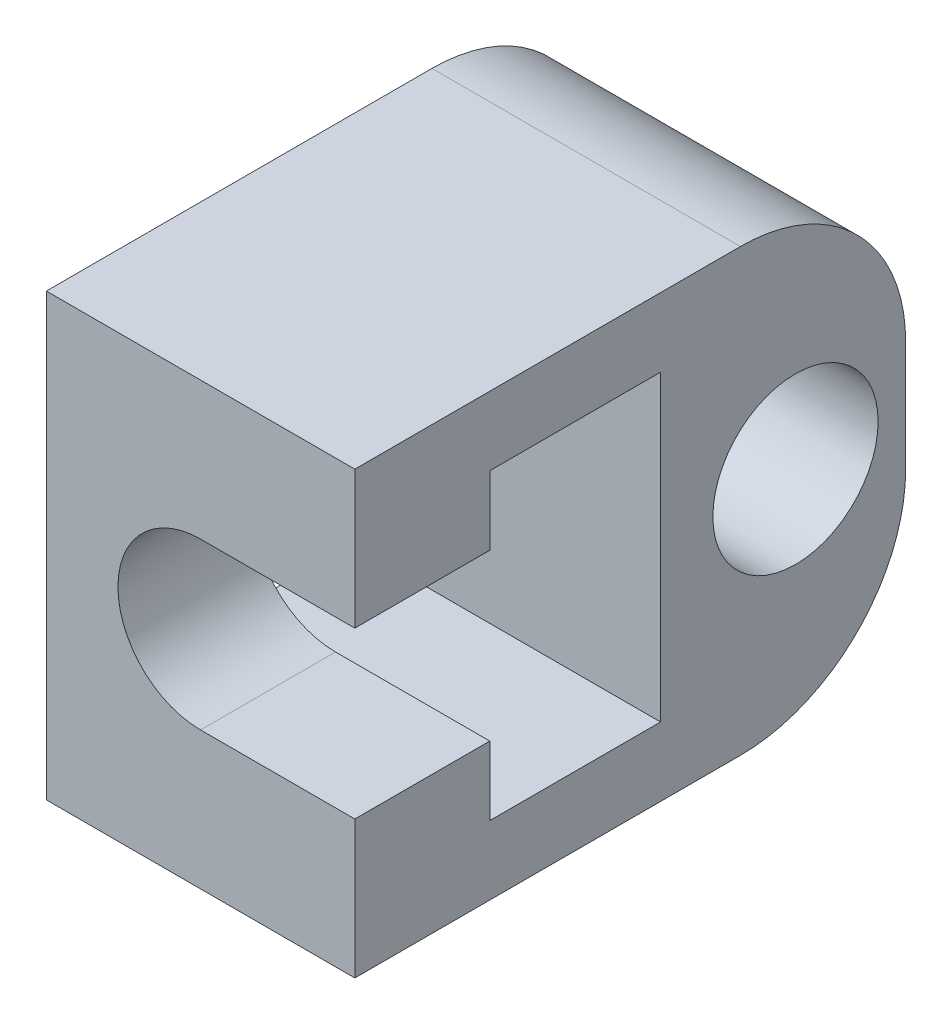
ISO-10303-21;
HEADER;
FILE_DESCRIPTION(('STEP AP214'),'2;1');
FILE_NAME('part.step','',(''),(''),'','','');
FILE_SCHEMA(('AUTOMOTIVE_DESIGN { 1 0 10303 214 1 1 1 1 }'));
ENDSEC;
DATA;
#1=APPLICATION_CONTEXT('core data for automotive mechanical design processes');
#2=APPLICATION_PROTOCOL_DEFINITION('international standard','automotive_design',2000,#1);
#3=PRODUCT_CONTEXT('',#1,'mechanical');
#4=PRODUCT('Part','Part','',(#3));
#5=PRODUCT_RELATED_PRODUCT_CATEGORY('part','',(#4));
#6=PRODUCT_DEFINITION_FORMATION('','',#4);
#7=PRODUCT_DEFINITION_CONTEXT('part definition',#1,'design');
#8=PRODUCT_DEFINITION('design','',#6,#7);
#9=PRODUCT_DEFINITION_SHAPE('','',#8);
#10=(LENGTH_UNIT() NAMED_UNIT(*) SI_UNIT(.MILLI.,.METRE.));
#11=(NAMED_UNIT(*) PLANE_ANGLE_UNIT() SI_UNIT($,.RADIAN.));
#12=(NAMED_UNIT(*) SI_UNIT($,.STERADIAN.) SOLID_ANGLE_UNIT());
#13=UNCERTAINTY_MEASURE_WITH_UNIT(LENGTH_MEASURE(1.E-05),#10,'distance_accuracy_value','');
#14=(GEOMETRIC_REPRESENTATION_CONTEXT(3) GLOBAL_UNCERTAINTY_ASSIGNED_CONTEXT((#13)) GLOBAL_UNIT_ASSIGNED_CONTEXT((#10,
#11,#12)) REPRESENTATION_CONTEXT('',''));
#15=CARTESIAN_POINT('',(0.,0.,0.));
#16=DIRECTION('',(0.,0.,1.));
#17=DIRECTION('',(1.,0.,0.));
#18=AXIS2_PLACEMENT_3D('',#15,#16,#17);
#19=CARTESIAN_POINT('',(2.8,8.,5.));
#20=DIRECTION('',(0.,0.,-1.));
#21=DIRECTION('',(-1.,0.,0.));
#22=AXIS2_PLACEMENT_3D('',#19,#20,#21);
#23=PLANE('',#22);
#24=DIRECTION('',(-1.,0.,0.));
#25=VECTOR('',#24,1.);
#26=CARTESIAN_POINT('',(0.,2.5,5.));
#27=LINE('',#26,#25);
#28=CARTESIAN_POINT('',(2.8,2.5,5.));
#29=VERTEX_POINT('',#28);
#30=CARTESIAN_POINT('',(0.,2.5,5.));
#31=VERTEX_POINT('',#30);
#32=EDGE_CURVE('E162',#29,#31,#27,.T.);
#33=ORIENTED_EDGE('',*,*,#32,.T.);
#34=CARTESIAN_POINT('',(0.,4.,5.));
#35=DIRECTION('',(0.,0.,1.));
#36=DIRECTION('',(1.,0.,0.));
#37=AXIS2_PLACEMENT_3D('',#34,#35,#36);
#38=CIRCLE('',#37,1.5);
#39=CARTESIAN_POINT('',(0.,5.5,5.));
#40=VERTEX_POINT('',#39);
#41=EDGE_CURVE('E293',#40,#31,#38,.T.);
#42=ORIENTED_EDGE('',*,*,#41,.F.);
#43=DIRECTION('',(1.,0.,0.));
#44=VECTOR('',#43,1.);
#45=CARTESIAN_POINT('',(0.,5.5,5.));
#46=LINE('',#45,#44);
#47=CARTESIAN_POINT('',(2.8,5.5,5.));
#48=VERTEX_POINT('',#47);
#49=EDGE_CURVE('E283',#40,#48,#46,.T.);
#50=ORIENTED_EDGE('',*,*,#49,.T.);
#51=DIRECTION('',(0.,-1.,0.));
#52=VECTOR('',#51,1.);
#53=CARTESIAN_POINT('',(2.8,8.,5.));
#54=LINE('',#53,#52);
#55=CARTESIAN_POINT('',(2.8,8.,5.));
#56=VERTEX_POINT('',#55);
#57=EDGE_CURVE('E163',#56,#48,#54,.T.);
#58=ORIENTED_EDGE('',*,*,#57,.F.);
#59=DIRECTION('',(1.,0.,0.));
#60=VECTOR('',#59,1.);
#61=CARTESIAN_POINT('',(2.8,8.,5.));
#62=LINE('',#61,#60);
#63=CARTESIAN_POINT('',(-2.8,8.,5.));
#64=VERTEX_POINT('',#63);
#65=EDGE_CURVE('E195',#64,#56,#62,.T.);
#66=ORIENTED_EDGE('',*,*,#65,.F.);
#67=DIRECTION('',(0.,-1.,0.));
#68=VECTOR('',#67,1.);
#69=CARTESIAN_POINT('',(-2.8,8.,5.));
#70=LINE('',#69,#68);
#71=CARTESIAN_POINT('',(-2.8,0.,5.));
#72=VERTEX_POINT('',#71);
#73=EDGE_CURVE('E208',#64,#72,#70,.T.);
#74=ORIENTED_EDGE('',*,*,#73,.T.);
#75=DIRECTION('',(1.,0.,0.));
#76=VECTOR('',#75,1.);
#77=CARTESIAN_POINT('',(2.8,0.,5.));
#78=LINE('',#77,#76);
#79=CARTESIAN_POINT('',(2.8,0.,5.));
#80=VERTEX_POINT('',#79);
#81=EDGE_CURVE('E198',#72,#80,#78,.T.);
#82=ORIENTED_EDGE('',*,*,#81,.T.);
#83=EDGE_CURVE('E206',#29,#80,#54,.T.);
#84=ORIENTED_EDGE('',*,*,#83,.F.);
#85=EDGE_LOOP('',(#33,#42,#50,#58,#66,#74,#82,#84));
#86=FACE_BOUND('',#85,.T.);
#87=ADVANCED_FACE('F39',(#86),#23,.F.);
#88=CARTESIAN_POINT('',(2.8,8.,5.));
#89=DIRECTION('',(-1.,0.,0.));
#90=DIRECTION('',(0.,0.,1.));
#91=AXIS2_PLACEMENT_3D('',#88,#89,#90);
#92=PLANE('',#91);
#93=CARTESIAN_POINT('',(2.8,4.,-3.));
#94=DIRECTION('',(1.,0.,0.));
#95=DIRECTION('',(0.,0.,-1.));
#96=AXIS2_PLACEMENT_3D('',#93,#94,#95);
#97=CIRCLE('',#96,1.5);
#98=CARTESIAN_POINT('',(2.8,4.,-4.5));
#99=VERTEX_POINT('',#98);
#100=EDGE_CURVE('E313',#99,#99,#97,.T.);
#101=ORIENTED_EDGE('',*,*,#100,.F.);
#102=EDGE_LOOP('',(#101));
#103=FACE_BOUND('',#102,.T.);
#104=DIRECTION('',(0.,0.,-1.));
#105=VECTOR('',#104,1.);
#106=CARTESIAN_POINT('',(2.8,0.,5.));
#107=LINE('',#106,#105);
#108=CARTESIAN_POINT('',(2.8,0.,-2.));
#109=VERTEX_POINT('',#108);
#110=EDGE_CURVE('E194',#80,#109,#107,.T.);
#111=ORIENTED_EDGE('',*,*,#110,.T.);
#112=CARTESIAN_POINT('',(2.8,3.,-2.));
#113=DIRECTION('',(-1.,0.,0.));
#114=DIRECTION('',(0.,0.,1.));
#115=AXIS2_PLACEMENT_3D('',#112,#113,#114);
#116=CIRCLE('',#115,3.);
#117=CARTESIAN_POINT('',(2.8,3.,-5.));
#118=VERTEX_POINT('',#117);
#119=EDGE_CURVE('E50',#109,#118,#116,.F.);
#120=ORIENTED_EDGE('',*,*,#119,.T.);
#121=DIRECTION('',(0.,-1.,0.));
#122=VECTOR('',#121,1.);
#123=CARTESIAN_POINT('',(2.8,8.,-5.));
#124=LINE('',#123,#122);
#125=CARTESIAN_POINT('',(2.8,5.,-5.));
#126=VERTEX_POINT('',#125);
#127=EDGE_CURVE('E201',#126,#118,#124,.T.);
#128=ORIENTED_EDGE('',*,*,#127,.F.);
#129=CARTESIAN_POINT('',(2.8,5.,-2.));
#130=DIRECTION('',(-1.,0.,0.));
#131=DIRECTION('',(0.,0.,1.));
#132=AXIS2_PLACEMENT_3D('',#129,#130,#131);
#133=CIRCLE('',#132,3.);
#134=CARTESIAN_POINT('',(2.8,8.,-2.));
#135=VERTEX_POINT('',#134);
#136=EDGE_CURVE('E53',#126,#135,#133,.F.);
#137=ORIENTED_EDGE('',*,*,#136,.T.);
#138=DIRECTION('',(0.,0.,-1.));
#139=VECTOR('',#138,1.);
#140=CARTESIAN_POINT('',(2.8,8.,5.));
#141=LINE('',#140,#139);
#142=EDGE_CURVE('E193',#56,#135,#141,.T.);
#143=ORIENTED_EDGE('',*,*,#142,.F.);
#144=ORIENTED_EDGE('',*,*,#57,.T.);
#145=DIRECTION('',(0.,0.,1.));
#146=VECTOR('',#145,1.);
#147=CARTESIAN_POINT('',(2.8,5.5,-5.001));
#148=LINE('',#147,#146);
#149=CARTESIAN_POINT('',(2.8,5.5,2.55));
#150=VERTEX_POINT('',#149);
#151=EDGE_CURVE('E149',#150,#48,#148,.T.);
#152=ORIENTED_EDGE('',*,*,#151,.F.);
#153=DIRECTION('',(0.,-1.,0.));
#154=VECTOR('',#153,1.);
#155=CARTESIAN_POINT('',(2.8,1.25,2.55));
#156=LINE('',#155,#154);
#157=CARTESIAN_POINT('',(2.8,6.75,2.55));
#158=VERTEX_POINT('',#157);
#159=EDGE_CURVE('E159',#158,#150,#156,.T.);
#160=ORIENTED_EDGE('',*,*,#159,.F.);
#161=DIRECTION('',(0.,0.,1.));
#162=VECTOR('',#161,1.);
#163=CARTESIAN_POINT('',(2.8,6.75,2.55));
#164=LINE('',#163,#162);
#165=CARTESIAN_POINT('',(2.8,6.75,-0.549999999999998));
#166=VERTEX_POINT('',#165);
#167=EDGE_CURVE('E174',#166,#158,#164,.T.);
#168=ORIENTED_EDGE('',*,*,#167,.F.);
#169=DIRECTION('',(0.,1.,0.));
#170=VECTOR('',#169,1.);
#171=CARTESIAN_POINT('',(2.8,1.25,-0.550000000000001));
#172=LINE('',#171,#170);
#173=CARTESIAN_POINT('',(2.8,1.25,-0.550000000000001));
#174=VERTEX_POINT('',#173);
#175=EDGE_CURVE('E285',#174,#166,#172,.T.);
#176=ORIENTED_EDGE('',*,*,#175,.F.);
#177=DIRECTION('',(0.,0.,-1.));
#178=VECTOR('',#177,1.);
#179=CARTESIAN_POINT('',(2.8,1.25,2.55));
#180=LINE('',#179,#178);
#181=CARTESIAN_POINT('',(2.8,1.25,2.55));
#182=VERTEX_POINT('',#181);
#183=EDGE_CURVE('E169',#182,#174,#180,.T.);
#184=ORIENTED_EDGE('',*,*,#183,.F.);
#185=CARTESIAN_POINT('',(2.8,2.5,2.55));
#186=VERTEX_POINT('',#185);
#187=EDGE_CURVE('E167',#186,#182,#156,.T.);
#188=ORIENTED_EDGE('',*,*,#187,.F.);
#189=DIRECTION('',(0.,0.,1.));
#190=VECTOR('',#189,1.);
#191=CARTESIAN_POINT('',(2.8,2.5,-5.001));
#192=LINE('',#191,#190);
#193=EDGE_CURVE('E294',#186,#29,#192,.T.);
#194=ORIENTED_EDGE('',*,*,#193,.T.);
#195=ORIENTED_EDGE('',*,*,#83,.T.);
#196=EDGE_LOOP('',(#111,#120,#128,#137,#143,#144,#152,#160,#168,#176,#184,#188,#194,#195));
#197=FACE_BOUND('',#196,.T.);
#198=ADVANCED_FACE('F160',(#103,#197),#92,.F.);
#199=CARTESIAN_POINT('',(-2.8,1.25,2.55));
#200=DIRECTION('',(0.,0.,1.));
#201=DIRECTION('',(0.,-1.,0.));
#202=AXIS2_PLACEMENT_3D('',#199,#200,#201);
#203=PLANE('',#202);
#204=DIRECTION('',(1.,0.,0.));
#205=VECTOR('',#204,1.);
#206=CARTESIAN_POINT('',(0.,2.5,2.55));
#207=LINE('',#206,#205);
#208=CARTESIAN_POINT('',(0.,2.5,2.55));
#209=VERTEX_POINT('',#208);
#210=EDGE_CURVE('E295',#209,#186,#207,.T.);
#211=ORIENTED_EDGE('',*,*,#210,.T.);
#212=ORIENTED_EDGE('',*,*,#187,.T.);
#213=DIRECTION('',(1.,0.,0.));
#214=VECTOR('',#213,1.);
#215=CARTESIAN_POINT('',(-2.8,1.25,2.55));
#216=LINE('',#215,#214);
#217=CARTESIAN_POINT('',(-2.8,1.25,2.55));
#218=VERTEX_POINT('',#217);
#219=EDGE_CURVE('E185',#218,#182,#216,.T.);
#220=ORIENTED_EDGE('',*,*,#219,.F.);
#221=DIRECTION('',(0.,-1.,0.));
#222=VECTOR('',#221,1.);
#223=CARTESIAN_POINT('',(-2.8,1.25,2.55));
#224=LINE('',#223,#222);
#225=CARTESIAN_POINT('',(-2.8,6.75,2.55));
#226=VERTEX_POINT('',#225);
#227=EDGE_CURVE('E280',#226,#218,#224,.T.);
#228=ORIENTED_EDGE('',*,*,#227,.F.);
#229=DIRECTION('',(1.,0.,0.));
#230=VECTOR('',#229,1.);
#231=CARTESIAN_POINT('',(-2.8,6.75,2.55));
#232=LINE('',#231,#230);
#233=EDGE_CURVE('E170',#226,#158,#232,.T.);
#234=ORIENTED_EDGE('',*,*,#233,.T.);
#235=ORIENTED_EDGE('',*,*,#159,.T.);
#236=DIRECTION('',(-1.,0.,0.));
#237=VECTOR('',#236,1.);
#238=CARTESIAN_POINT('',(0.,5.5,2.55));
#239=LINE('',#238,#237);
#240=CARTESIAN_POINT('',(0.,5.5,2.55));
#241=VERTEX_POINT('',#240);
#242=EDGE_CURVE('E144',#150,#241,#239,.T.);
#243=ORIENTED_EDGE('',*,*,#242,.T.);
#244=CARTESIAN_POINT('',(0.,4.,2.55));
#245=DIRECTION('',(0.,0.,1.));
#246=DIRECTION('',(0.,-1.,0.));
#247=AXIS2_PLACEMENT_3D('',#244,#245,#246);
#248=CIRCLE('',#247,1.5);
#249=EDGE_CURVE('E308',#209,#241,#248,.F.);
#250=ORIENTED_EDGE('',*,*,#249,.F.);
#251=EDGE_LOOP('',(#211,#212,#220,#228,#234,#235,#243,#250));
#252=FACE_BOUND('',#251,.T.);
#253=ADVANCED_FACE('F164',(#252),#203,.F.);
#254=CARTESIAN_POINT('',(-2.8,8.,5.));
#255=DIRECTION('',(1.,0.,0.));
#256=DIRECTION('',(0.,0.,-1.));
#257=AXIS2_PLACEMENT_3D('',#254,#255,#256);
#258=PLANE('',#257);
#259=CARTESIAN_POINT('',(-2.8,4.,-3.));
#260=DIRECTION('',(1.,0.,0.));
#261=DIRECTION('',(0.,0.,-1.));
#262=AXIS2_PLACEMENT_3D('',#259,#260,#261);
#263=CIRCLE('',#262,1.5);
#264=CARTESIAN_POINT('',(-2.8,4.,-4.5));
#265=VERTEX_POINT('',#264);
#266=EDGE_CURVE('E266',#265,#265,#263,.T.);
#267=ORIENTED_EDGE('',*,*,#266,.T.);
#268=EDGE_LOOP('',(#267));
#269=FACE_BOUND('',#268,.T.);
#270=DIRECTION('',(0.,0.,-1.));
#271=VECTOR('',#270,1.);
#272=CARTESIAN_POINT('',(-2.8,1.25,2.55));
#273=LINE('',#272,#271);
#274=CARTESIAN_POINT('',(-2.8,1.25,-0.550000000000001));
#275=VERTEX_POINT('',#274);
#276=EDGE_CURVE('E186',#218,#275,#273,.T.);
#277=ORIENTED_EDGE('',*,*,#276,.T.);
#278=DIRECTION('',(0.,1.,0.));
#279=VECTOR('',#278,1.);
#280=CARTESIAN_POINT('',(-2.8,1.25,-0.550000000000001));
#281=LINE('',#280,#279);
#282=CARTESIAN_POINT('',(-2.8,6.75,-0.549999999999998));
#283=VERTEX_POINT('',#282);
#284=EDGE_CURVE('E173',#275,#283,#281,.T.);
#285=ORIENTED_EDGE('',*,*,#284,.T.);
#286=DIRECTION('',(0.,0.,1.));
#287=VECTOR('',#286,1.);
#288=CARTESIAN_POINT('',(-2.8,6.75,2.55));
#289=LINE('',#288,#287);
#290=EDGE_CURVE('E278',#283,#226,#289,.T.);
#291=ORIENTED_EDGE('',*,*,#290,.T.);
#292=ORIENTED_EDGE('',*,*,#227,.T.);
#293=EDGE_LOOP('',(#277,#285,#291,#292));
#294=FACE_BOUND('',#293,.T.);
#295=DIRECTION('',(0.,-1.,0.));
#296=VECTOR('',#295,1.);
#297=CARTESIAN_POINT('',(-2.8,8.,-5.));
#298=LINE('',#297,#296);
#299=CARTESIAN_POINT('',(-2.8,5.,-5.));
#300=VERTEX_POINT('',#299);
#301=CARTESIAN_POINT('',(-2.8,3.,-5.));
#302=VERTEX_POINT('',#301);
#303=EDGE_CURVE('E200',#300,#302,#298,.T.);
#304=ORIENTED_EDGE('',*,*,#303,.T.);
#305=CARTESIAN_POINT('',(-2.8,3.,-2.));
#306=DIRECTION('',(1.,0.,0.));
#307=DIRECTION('',(0.,0.,-1.));
#308=AXIS2_PLACEMENT_3D('',#305,#306,#307);
#309=CIRCLE('',#308,3.);
#310=CARTESIAN_POINT('',(-2.8,0.,-2.));
#311=VERTEX_POINT('',#310);
#312=EDGE_CURVE('E217',#302,#311,#309,.F.);
#313=ORIENTED_EDGE('',*,*,#312,.T.);
#314=DIRECTION('',(0.,0.,1.));
#315=VECTOR('',#314,1.);
#316=CARTESIAN_POINT('',(-2.8,0.,5.));
#317=LINE('',#316,#315);
#318=EDGE_CURVE('E181',#311,#72,#317,.T.);
#319=ORIENTED_EDGE('',*,*,#318,.T.);
#320=ORIENTED_EDGE('',*,*,#73,.F.);
#321=DIRECTION('',(0.,0.,1.));
#322=VECTOR('',#321,1.);
#323=CARTESIAN_POINT('',(-2.8,8.,5.));
#324=LINE('',#323,#322);
#325=CARTESIAN_POINT('',(-2.8,8.,-2.));
#326=VERTEX_POINT('',#325);
#327=EDGE_CURVE('E188',#326,#64,#324,.T.);
#328=ORIENTED_EDGE('',*,*,#327,.F.);
#329=CARTESIAN_POINT('',(-2.8,5.,-2.));
#330=DIRECTION('',(1.,0.,0.));
#331=DIRECTION('',(0.,0.,-1.));
#332=AXIS2_PLACEMENT_3D('',#329,#330,#331);
#333=CIRCLE('',#332,3.);
#334=EDGE_CURVE('E220',#326,#300,#333,.F.);
#335=ORIENTED_EDGE('',*,*,#334,.T.);
#336=EDGE_LOOP('',(#304,#313,#319,#320,#328,#335));
#337=FACE_BOUND('',#336,.T.);
#338=ADVANCED_FACE('F235',(#269,#294,#337),#258,.F.);
#339=CARTESIAN_POINT('',(2.8,8.,-5.));
#340=DIRECTION('',(0.,0.,1.));
#341=DIRECTION('',(1.,0.,0.));
#342=AXIS2_PLACEMENT_3D('',#339,#340,#341);
#343=PLANE('',#342);
#344=ORIENTED_EDGE('',*,*,#127,.T.);
#345=DIRECTION('',(-1.,0.,0.));
#346=VECTOR('',#345,1.);
#347=CARTESIAN_POINT('',(2.8,3.,-5.));
#348=LINE('',#347,#346);
#349=EDGE_CURVE('E213',#118,#302,#348,.T.);
#350=ORIENTED_EDGE('',*,*,#349,.T.);
#351=ORIENTED_EDGE('',*,*,#303,.F.);
#352=DIRECTION('',(-1.,0.,0.));
#353=VECTOR('',#352,1.);
#354=CARTESIAN_POINT('',(2.8,5.,-5.));
#355=LINE('',#354,#353);
#356=EDGE_CURVE('E214',#300,#126,#355,.F.);
#357=ORIENTED_EDGE('',*,*,#356,.T.);
#358=EDGE_LOOP('',(#344,#350,#351,#357));
#359=FACE_BOUND('',#358,.T.);
#360=ADVANCED_FACE('F227',(#359),#343,.F.);
#361=CARTESIAN_POINT('',(0.,8.,0.));
#362=DIRECTION('',(0.,1.,0.));
#363=DIRECTION('',(0.,0.,1.));
#364=AXIS2_PLACEMENT_3D('',#361,#362,#363);
#365=PLANE('',#364);
#366=ORIENTED_EDGE('',*,*,#142,.T.);
#367=DIRECTION('',(-1.,0.,0.));
#368=VECTOR('',#367,1.);
#369=CARTESIAN_POINT('',(-2.8,8.,-2.));
#370=LINE('',#369,#368);
#371=EDGE_CURVE('E11',#135,#326,#370,.T.);
#372=ORIENTED_EDGE('',*,*,#371,.T.);
#373=ORIENTED_EDGE('',*,*,#327,.T.);
#374=ORIENTED_EDGE('',*,*,#65,.T.);
#375=EDGE_LOOP('',(#366,#372,#373,#374));
#376=FACE_BOUND('',#375,.T.);
#377=ADVANCED_FACE('F245',(#376),#365,.T.);
#378=CARTESIAN_POINT('',(0.,0.,0.));
#379=DIRECTION('',(0.,1.,0.));
#380=DIRECTION('',(0.,0.,1.));
#381=AXIS2_PLACEMENT_3D('',#378,#379,#380);
#382=PLANE('',#381);
#383=ORIENTED_EDGE('',*,*,#318,.F.);
#384=DIRECTION('',(-1.,0.,0.));
#385=VECTOR('',#384,1.);
#386=CARTESIAN_POINT('',(0.,0.,-2.));
#387=LINE('',#386,#385);
#388=EDGE_CURVE('E65',#311,#109,#387,.F.);
#389=ORIENTED_EDGE('',*,*,#388,.T.);
#390=ORIENTED_EDGE('',*,*,#110,.F.);
#391=ORIENTED_EDGE('',*,*,#81,.F.);
#392=EDGE_LOOP('',(#383,#389,#390,#391));
#393=FACE_BOUND('',#392,.T.);
#394=ADVANCED_FACE('F232',(#393),#382,.F.);
#395=CARTESIAN_POINT('',(-2.8,1.25,-0.550000000000001));
#396=DIRECTION('',(0.,0.,-1.));
#397=DIRECTION('',(0.,1.,0.));
#398=AXIS2_PLACEMENT_3D('',#395,#396,#397);
#399=PLANE('',#398);
#400=ORIENTED_EDGE('',*,*,#175,.T.);
#401=DIRECTION('',(1.,0.,0.));
#402=VECTOR('',#401,1.);
#403=CARTESIAN_POINT('',(-2.8,6.75,-0.549999999999998));
#404=LINE('',#403,#402);
#405=EDGE_CURVE('E187',#283,#166,#404,.T.);
#406=ORIENTED_EDGE('',*,*,#405,.F.);
#407=ORIENTED_EDGE('',*,*,#284,.F.);
#408=DIRECTION('',(1.,0.,0.));
#409=VECTOR('',#408,1.);
#410=CARTESIAN_POINT('',(-2.8,1.25,-0.550000000000001));
#411=LINE('',#410,#409);
#412=EDGE_CURVE('E177',#275,#174,#411,.T.);
#413=ORIENTED_EDGE('',*,*,#412,.T.);
#414=EDGE_LOOP('',(#400,#406,#407,#413));
#415=FACE_BOUND('',#414,.T.);
#416=ADVANCED_FACE('F334',(#415),#399,.F.);
#417=CARTESIAN_POINT('',(-2.8,1.25,2.55));
#418=DIRECTION('',(0.,-1.,0.));
#419=DIRECTION('',(0.,0.,-1.));
#420=AXIS2_PLACEMENT_3D('',#417,#418,#419);
#421=PLANE('',#420);
#422=ORIENTED_EDGE('',*,*,#183,.T.);
#423=ORIENTED_EDGE('',*,*,#412,.F.);
#424=ORIENTED_EDGE('',*,*,#276,.F.);
#425=ORIENTED_EDGE('',*,*,#219,.T.);
#426=EDGE_LOOP('',(#422,#423,#424,#425));
#427=FACE_BOUND('',#426,.T.);
#428=ADVANCED_FACE('F306',(#427),#421,.F.);
#429=CARTESIAN_POINT('',(-2.8,6.75,2.55));
#430=DIRECTION('',(0.,1.,0.));
#431=DIRECTION('',(0.,0.,1.));
#432=AXIS2_PLACEMENT_3D('',#429,#430,#431);
#433=PLANE('',#432);
#434=ORIENTED_EDGE('',*,*,#167,.T.);
#435=ORIENTED_EDGE('',*,*,#233,.F.);
#436=ORIENTED_EDGE('',*,*,#290,.F.);
#437=ORIENTED_EDGE('',*,*,#405,.T.);
#438=EDGE_LOOP('',(#434,#435,#436,#437));
#439=FACE_BOUND('',#438,.T.);
#440=ADVANCED_FACE('F303',(#439),#433,.F.);
#441=CARTESIAN_POINT('',(0.,4.,-5.001));
#442=DIRECTION('',(0.,0.,1.));
#443=DIRECTION('',(1.,0.,0.));
#444=AXIS2_PLACEMENT_3D('',#441,#442,#443);
#445=CYLINDRICAL_SURFACE('',#444,1.5);
#446=ORIENTED_EDGE('',*,*,#249,.T.);
#447=DIRECTION('',(0.,0.,1.));
#448=VECTOR('',#447,1.);
#449=CARTESIAN_POINT('',(0.,5.5,-5.001));
#450=LINE('',#449,#448);
#451=EDGE_CURVE('E148',#241,#40,#450,.T.);
#452=ORIENTED_EDGE('',*,*,#451,.T.);
#453=ORIENTED_EDGE('',*,*,#41,.T.);
#454=DIRECTION('',(0.,0.,1.));
#455=VECTOR('',#454,1.);
#456=CARTESIAN_POINT('',(0.,2.5,-5.001));
#457=LINE('',#456,#455);
#458=EDGE_CURVE('E298',#209,#31,#457,.T.);
#459=ORIENTED_EDGE('',*,*,#458,.F.);
#460=EDGE_LOOP('',(#446,#452,#453,#459));
#461=FACE_BOUND('',#460,.T.);
#462=ADVANCED_FACE('F328',(#461),#445,.F.);
#463=CARTESIAN_POINT('',(0.,2.5,-5.001));
#464=DIRECTION('',(0.,1.,0.));
#465=DIRECTION('',(-1.,0.,0.));
#466=AXIS2_PLACEMENT_3D('',#463,#464,#465);
#467=PLANE('',#466);
#468=ORIENTED_EDGE('',*,*,#458,.T.);
#469=ORIENTED_EDGE('',*,*,#32,.F.);
#470=ORIENTED_EDGE('',*,*,#193,.F.);
#471=ORIENTED_EDGE('',*,*,#210,.F.);
#472=EDGE_LOOP('',(#468,#469,#470,#471));
#473=FACE_BOUND('',#472,.T.);
#474=ADVANCED_FACE('F309',(#473),#467,.T.);
#475=CARTESIAN_POINT('',(0.,5.5,-5.001));
#476=DIRECTION('',(0.,-1.,0.));
#477=DIRECTION('',(0.,0.,-1.));
#478=AXIS2_PLACEMENT_3D('',#475,#476,#477);
#479=PLANE('',#478);
#480=ORIENTED_EDGE('',*,*,#151,.T.);
#481=ORIENTED_EDGE('',*,*,#49,.F.);
#482=ORIENTED_EDGE('',*,*,#451,.F.);
#483=ORIENTED_EDGE('',*,*,#242,.F.);
#484=EDGE_LOOP('',(#480,#481,#482,#483));
#485=FACE_BOUND('',#484,.T.);
#486=ADVANCED_FACE('F147',(#485),#479,.T.);
#487=CARTESIAN_POINT('',(-2.8,4.,-3.));
#488=DIRECTION('',(1.,0.,0.));
#489=DIRECTION('',(0.,0.,-1.));
#490=AXIS2_PLACEMENT_3D('',#487,#488,#489);
#491=CYLINDRICAL_SURFACE('',#490,1.5);
#492=ORIENTED_EDGE('',*,*,#266,.F.);
#493=EDGE_LOOP('',(#492));
#494=FACE_BOUND('',#493,.T.);
#495=ORIENTED_EDGE('',*,*,#100,.T.);
#496=EDGE_LOOP('',(#495));
#497=FACE_BOUND('',#496,.T.);
#498=ADVANCED_FACE('F248',(#494,#497),#491,.F.);
#499=CARTESIAN_POINT('',(2.8,3.,-2.));
#500=DIRECTION('',(-1.,0.,0.));
#501=DIRECTION('',(0.,0.,1.));
#502=AXIS2_PLACEMENT_3D('',#499,#500,#501);
#503=CYLINDRICAL_SURFACE('',#502,3.);
#504=ORIENTED_EDGE('',*,*,#119,.F.);
#505=ORIENTED_EDGE('',*,*,#388,.F.);
#506=ORIENTED_EDGE('',*,*,#312,.F.);
#507=ORIENTED_EDGE('',*,*,#349,.F.);
#508=EDGE_LOOP('',(#504,#505,#506,#507));
#509=FACE_BOUND('',#508,.T.);
#510=ADVANCED_FACE('F229',(#509),#503,.T.);
#511=CARTESIAN_POINT('',(0.,5.,-2.));
#512=DIRECTION('',(1.,0.,0.));
#513=DIRECTION('',(0.,0.,-1.));
#514=AXIS2_PLACEMENT_3D('',#511,#512,#513);
#515=CYLINDRICAL_SURFACE('',#514,3.);
#516=ORIENTED_EDGE('',*,*,#136,.F.);
#517=ORIENTED_EDGE('',*,*,#356,.F.);
#518=ORIENTED_EDGE('',*,*,#334,.F.);
#519=ORIENTED_EDGE('',*,*,#371,.F.);
#520=EDGE_LOOP('',(#516,#517,#518,#519));
#521=FACE_BOUND('',#520,.T.);
#522=ADVANCED_FACE('F41',(#521),#515,.T.);
#523=CLOSED_SHELL('',(#87,#198,#253,#338,#360,#377,#394,#416,#428,#440,#462,#474,#486,#498,#510,#522));
#524=MANIFOLD_SOLID_BREP('B2',#523);
#525=ADVANCED_BREP_SHAPE_REPRESENTATION('',(#18,#524),#14);
#526=SHAPE_DEFINITION_REPRESENTATION(#9,#525);
ENDSEC;
END-ISO-10303-21;
